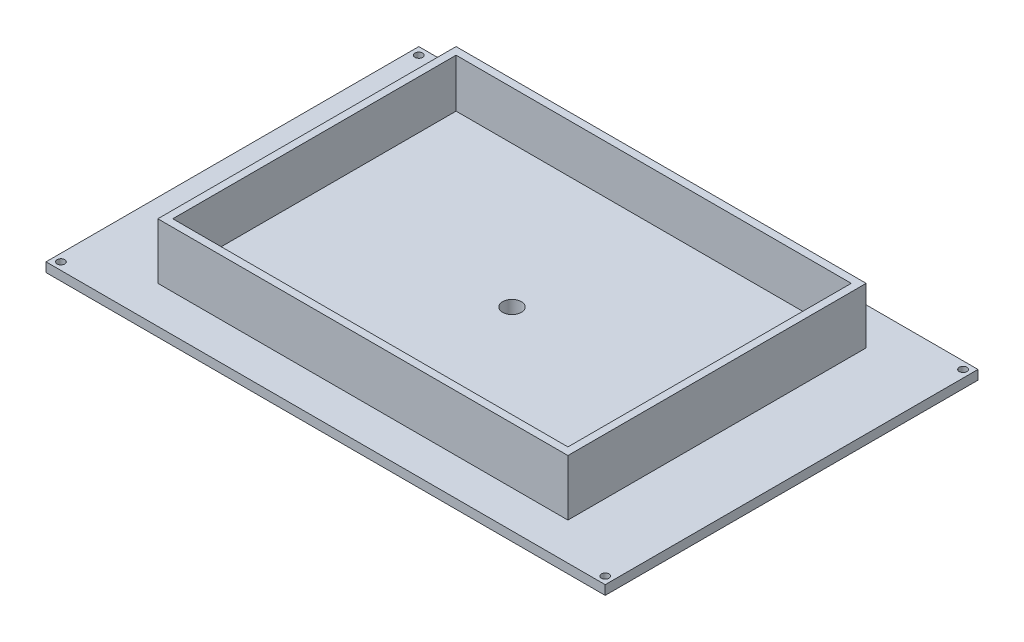
ISO-10303-21;
HEADER;
FILE_DESCRIPTION(('STEP AP214'),'2;1');
FILE_NAME('part.step','',(''),(''),'','','');
FILE_SCHEMA(('AUTOMOTIVE_DESIGN { 1 0 10303 214 1 1 1 1 }'));
ENDSEC;
DATA;
#1=APPLICATION_CONTEXT('core data for automotive mechanical design processes');
#2=APPLICATION_PROTOCOL_DEFINITION('international standard','automotive_design',2000,#1);
#3=PRODUCT_CONTEXT('',#1,'mechanical');
#4=PRODUCT('Part','Part','',(#3));
#5=PRODUCT_RELATED_PRODUCT_CATEGORY('part','',(#4));
#6=PRODUCT_DEFINITION_FORMATION('','',#4);
#7=PRODUCT_DEFINITION_CONTEXT('part definition',#1,'design');
#8=PRODUCT_DEFINITION('design','',#6,#7);
#9=PRODUCT_DEFINITION_SHAPE('','',#8);
#10=(LENGTH_UNIT() NAMED_UNIT(*) SI_UNIT(.MILLI.,.METRE.));
#11=(NAMED_UNIT(*) PLANE_ANGLE_UNIT() SI_UNIT($,.RADIAN.));
#12=(NAMED_UNIT(*) SI_UNIT($,.STERADIAN.) SOLID_ANGLE_UNIT());
#13=UNCERTAINTY_MEASURE_WITH_UNIT(LENGTH_MEASURE(1.E-05),#10,'distance_accuracy_value','');
#14=(GEOMETRIC_REPRESENTATION_CONTEXT(3) GLOBAL_UNCERTAINTY_ASSIGNED_CONTEXT((#13)) GLOBAL_UNIT_ASSIGNED_CONTEXT((#10,
#11,#12)) REPRESENTATION_CONTEXT('',''));
#15=CARTESIAN_POINT('',(0.,0.,0.));
#16=DIRECTION('',(0.,0.,1.));
#17=DIRECTION('',(1.,0.,0.));
#18=AXIS2_PLACEMENT_3D('',#15,#16,#17);
#19=CARTESIAN_POINT('',(110.,30.,-80.));
#20=DIRECTION('',(0.,0.,1.));
#21=DIRECTION('',(1.,0.,0.));
#22=AXIS2_PLACEMENT_3D('',#19,#20,#21);
#23=PLANE('',#22);
#24=DIRECTION('',(-1.,0.,0.));
#25=VECTOR('',#24,1.);
#26=CARTESIAN_POINT('',(110.,0.,-80.));
#27=LINE('',#26,#25);
#28=CARTESIAN_POINT('',(110.,0.,-80.));
#29=VERTEX_POINT('',#28);
#30=CARTESIAN_POINT('',(-110.,0.,-80.));
#31=VERTEX_POINT('',#30);
#32=EDGE_CURVE('E209',#29,#31,#27,.T.);
#33=ORIENTED_EDGE('',*,*,#32,.T.);
#34=DIRECTION('',(0.,-1.,0.));
#35=VECTOR('',#34,1.);
#36=CARTESIAN_POINT('',(-110.,30.,-80.));
#37=LINE('',#36,#35);
#38=CARTESIAN_POINT('',(-110.,30.,-80.));
#39=VERTEX_POINT('',#38);
#40=EDGE_CURVE('E11',#39,#31,#37,.T.);
#41=ORIENTED_EDGE('',*,*,#40,.F.);
#42=DIRECTION('',(-1.,0.,0.));
#43=VECTOR('',#42,1.);
#44=CARTESIAN_POINT('',(110.,30.,-80.));
#45=LINE('',#44,#43);
#46=CARTESIAN_POINT('',(110.,30.,-80.));
#47=VERTEX_POINT('',#46);
#48=EDGE_CURVE('E90',#47,#39,#45,.T.);
#49=ORIENTED_EDGE('',*,*,#48,.F.);
#50=DIRECTION('',(0.,-1.,0.));
#51=VECTOR('',#50,1.);
#52=CARTESIAN_POINT('',(110.,30.,-80.));
#53=LINE('',#52,#51);
#54=EDGE_CURVE('E230',#47,#29,#53,.T.);
#55=ORIENTED_EDGE('',*,*,#54,.T.);
#56=EDGE_LOOP('',(#33,#41,#49,#55));
#57=FACE_BOUND('',#56,.T.);
#58=ADVANCED_FACE('F43',(#57),#23,.F.);
#59=CARTESIAN_POINT('',(-110.,30.,80.));
#60=DIRECTION('',(-1.,0.,0.));
#61=DIRECTION('',(0.,0.,1.));
#62=AXIS2_PLACEMENT_3D('',#59,#60,#61);
#63=PLANE('',#62);
#64=DIRECTION('',(0.,0.,-1.));
#65=VECTOR('',#64,1.);
#66=CARTESIAN_POINT('',(-110.,0.,80.));
#67=LINE('',#66,#65);
#68=CARTESIAN_POINT('',(-110.,0.,80.));
#69=VERTEX_POINT('',#68);
#70=EDGE_CURVE('E233',#69,#31,#67,.T.);
#71=ORIENTED_EDGE('',*,*,#70,.F.);
#72=DIRECTION('',(0.,-1.,0.));
#73=VECTOR('',#72,1.);
#74=CARTESIAN_POINT('',(-110.,30.,80.));
#75=LINE('',#74,#73);
#76=CARTESIAN_POINT('',(-110.,30.,80.));
#77=VERTEX_POINT('',#76);
#78=EDGE_CURVE('E51',#77,#69,#75,.T.);
#79=ORIENTED_EDGE('',*,*,#78,.F.);
#80=DIRECTION('',(0.,0.,-1.));
#81=VECTOR('',#80,1.);
#82=CARTESIAN_POINT('',(-110.,30.,80.));
#83=LINE('',#82,#81);
#84=EDGE_CURVE('E220',#77,#39,#83,.T.);
#85=ORIENTED_EDGE('',*,*,#84,.T.);
#86=ORIENTED_EDGE('',*,*,#40,.T.);
#87=EDGE_LOOP('',(#71,#79,#85,#86));
#88=FACE_BOUND('',#87,.T.);
#89=ADVANCED_FACE('F253',(#88),#63,.T.);
#90=CARTESIAN_POINT('',(110.,30.,80.));
#91=DIRECTION('',(0.,0.,1.));
#92=DIRECTION('',(1.,0.,0.));
#93=AXIS2_PLACEMENT_3D('',#90,#91,#92);
#94=PLANE('',#93);
#95=DIRECTION('',(-1.,0.,0.));
#96=VECTOR('',#95,1.);
#97=CARTESIAN_POINT('',(110.,0.,80.));
#98=LINE('',#97,#96);
#99=CARTESIAN_POINT('',(110.,0.,80.));
#100=VERTEX_POINT('',#99);
#101=EDGE_CURVE('E237',#100,#69,#98,.T.);
#102=ORIENTED_EDGE('',*,*,#101,.F.);
#103=DIRECTION('',(0.,-1.,0.));
#104=VECTOR('',#103,1.);
#105=CARTESIAN_POINT('',(110.,30.,80.));
#106=LINE('',#105,#104);
#107=CARTESIAN_POINT('',(110.,30.,80.));
#108=VERTEX_POINT('',#107);
#109=EDGE_CURVE('E245',#108,#100,#106,.T.);
#110=ORIENTED_EDGE('',*,*,#109,.F.);
#111=DIRECTION('',(-1.,0.,0.));
#112=VECTOR('',#111,1.);
#113=CARTESIAN_POINT('',(110.,30.,80.));
#114=LINE('',#113,#112);
#115=EDGE_CURVE('E224',#108,#77,#114,.T.);
#116=ORIENTED_EDGE('',*,*,#115,.T.);
#117=ORIENTED_EDGE('',*,*,#78,.T.);
#118=EDGE_LOOP('',(#102,#110,#116,#117));
#119=FACE_BOUND('',#118,.T.);
#120=ADVANCED_FACE('F251',(#119),#94,.T.);
#121=CARTESIAN_POINT('',(110.,30.,80.));
#122=DIRECTION('',(-1.,0.,0.));
#123=DIRECTION('',(0.,0.,1.));
#124=AXIS2_PLACEMENT_3D('',#121,#122,#123);
#125=PLANE('',#124);
#126=DIRECTION('',(0.,0.,-1.));
#127=VECTOR('',#126,1.);
#128=CARTESIAN_POINT('',(110.,0.,80.));
#129=LINE('',#128,#127);
#130=EDGE_CURVE('E85',#100,#29,#129,.T.);
#131=ORIENTED_EDGE('',*,*,#130,.T.);
#132=ORIENTED_EDGE('',*,*,#54,.F.);
#133=DIRECTION('',(0.,0.,-1.));
#134=VECTOR('',#133,1.);
#135=CARTESIAN_POINT('',(110.,30.,80.));
#136=LINE('',#135,#134);
#137=EDGE_CURVE('E67',#108,#47,#136,.T.);
#138=ORIENTED_EDGE('',*,*,#137,.F.);
#139=ORIENTED_EDGE('',*,*,#109,.T.);
#140=EDGE_LOOP('',(#131,#132,#138,#139));
#141=FACE_BOUND('',#140,.T.);
#142=ADVANCED_FACE('F258',(#141),#125,.F.);
#143=CARTESIAN_POINT('',(0.,30.,0.));
#144=DIRECTION('',(0.,-1.,0.));
#145=DIRECTION('',(0.,0.,-1.));
#146=AXIS2_PLACEMENT_3D('',#143,#144,#145);
#147=PLANE('',#146);
#148=DIRECTION('',(-1.,0.,0.));
#149=VECTOR('',#148,1.);
#150=CARTESIAN_POINT('',(-106.,30.,-76.));
#151=LINE('',#150,#149);
#152=CARTESIAN_POINT('',(106.,30.,-76.));
#153=VERTEX_POINT('',#152);
#154=CARTESIAN_POINT('',(-106.,30.,-76.));
#155=VERTEX_POINT('',#154);
#156=EDGE_CURVE('E172',#153,#155,#151,.T.);
#157=ORIENTED_EDGE('',*,*,#156,.F.);
#158=DIRECTION('',(0.,0.,-1.));
#159=VECTOR('',#158,1.);
#160=CARTESIAN_POINT('',(106.,30.,76.));
#161=LINE('',#160,#159);
#162=CARTESIAN_POINT('',(106.,30.,76.));
#163=VERTEX_POINT('',#162);
#164=EDGE_CURVE('E58',#163,#153,#161,.T.);
#165=ORIENTED_EDGE('',*,*,#164,.F.);
#166=DIRECTION('',(1.,0.,0.));
#167=VECTOR('',#166,1.);
#168=CARTESIAN_POINT('',(-106.,30.,76.));
#169=LINE('',#168,#167);
#170=CARTESIAN_POINT('',(-106.,30.,76.));
#171=VERTEX_POINT('',#170);
#172=EDGE_CURVE('E183',#171,#163,#169,.T.);
#173=ORIENTED_EDGE('',*,*,#172,.F.);
#174=DIRECTION('',(0.,0.,1.));
#175=VECTOR('',#174,1.);
#176=CARTESIAN_POINT('',(-106.,30.,76.));
#177=LINE('',#176,#175);
#178=EDGE_CURVE('E199',#155,#171,#177,.T.);
#179=ORIENTED_EDGE('',*,*,#178,.F.);
#180=EDGE_LOOP('',(#157,#165,#173,#179));
#181=FACE_BOUND('',#180,.T.);
#182=ORIENTED_EDGE('',*,*,#48,.T.);
#183=ORIENTED_EDGE('',*,*,#84,.F.);
#184=ORIENTED_EDGE('',*,*,#115,.F.);
#185=ORIENTED_EDGE('',*,*,#137,.T.);
#186=EDGE_LOOP('',(#182,#183,#184,#185));
#187=FACE_BOUND('',#186,.T.);
#188=ADVANCED_FACE('F259',(#181,#187),#147,.F.);
#189=CARTESIAN_POINT('',(106.,4.,76.));
#190=DIRECTION('',(1.,0.,0.));
#191=DIRECTION('',(0.,0.,-1.));
#192=AXIS2_PLACEMENT_3D('',#189,#190,#191);
#193=PLANE('',#192);
#194=ORIENTED_EDGE('',*,*,#164,.T.);
#195=DIRECTION('',(0.,1.,0.));
#196=VECTOR('',#195,1.);
#197=CARTESIAN_POINT('',(106.,4.,-76.));
#198=LINE('',#197,#196);
#199=CARTESIAN_POINT('',(106.,4.,-76.));
#200=VERTEX_POINT('',#199);
#201=EDGE_CURVE('E194',#200,#153,#198,.T.);
#202=ORIENTED_EDGE('',*,*,#201,.F.);
#203=DIRECTION('',(0.,0.,-1.));
#204=VECTOR('',#203,1.);
#205=CARTESIAN_POINT('',(106.,4.,76.));
#206=LINE('',#205,#204);
#207=CARTESIAN_POINT('',(106.,4.,76.));
#208=VERTEX_POINT('',#207);
#209=EDGE_CURVE('E178',#208,#200,#206,.T.);
#210=ORIENTED_EDGE('',*,*,#209,.F.);
#211=DIRECTION('',(0.,1.,0.));
#212=VECTOR('',#211,1.);
#213=CARTESIAN_POINT('',(106.,4.,76.));
#214=LINE('',#213,#212);
#215=EDGE_CURVE('E206',#208,#163,#214,.T.);
#216=ORIENTED_EDGE('',*,*,#215,.T.);
#217=EDGE_LOOP('',(#194,#202,#210,#216));
#218=FACE_BOUND('',#217,.T.);
#219=ADVANCED_FACE('F261',(#218),#193,.F.);
#220=CARTESIAN_POINT('',(-106.,4.,76.));
#221=DIRECTION('',(0.,0.,1.));
#222=DIRECTION('',(1.,0.,0.));
#223=AXIS2_PLACEMENT_3D('',#220,#221,#222);
#224=PLANE('',#223);
#225=ORIENTED_EDGE('',*,*,#172,.T.);
#226=ORIENTED_EDGE('',*,*,#215,.F.);
#227=DIRECTION('',(1.,0.,0.));
#228=VECTOR('',#227,1.);
#229=CARTESIAN_POINT('',(-106.,4.,76.));
#230=LINE('',#229,#228);
#231=CARTESIAN_POINT('',(-106.,4.,76.));
#232=VERTEX_POINT('',#231);
#233=EDGE_CURVE('E191',#232,#208,#230,.T.);
#234=ORIENTED_EDGE('',*,*,#233,.F.);
#235=DIRECTION('',(0.,1.,0.));
#236=VECTOR('',#235,1.);
#237=CARTESIAN_POINT('',(-106.,4.,76.));
#238=LINE('',#237,#236);
#239=EDGE_CURVE('E210',#232,#171,#238,.T.);
#240=ORIENTED_EDGE('',*,*,#239,.T.);
#241=EDGE_LOOP('',(#225,#226,#234,#240));
#242=FACE_BOUND('',#241,.T.);
#243=ADVANCED_FACE('F268',(#242),#224,.F.);
#244=CARTESIAN_POINT('',(-106.,4.,76.));
#245=DIRECTION('',(-1.,0.,0.));
#246=DIRECTION('',(0.,0.,1.));
#247=AXIS2_PLACEMENT_3D('',#244,#245,#246);
#248=PLANE('',#247);
#249=ORIENTED_EDGE('',*,*,#178,.T.);
#250=ORIENTED_EDGE('',*,*,#239,.F.);
#251=DIRECTION('',(0.,0.,1.));
#252=VECTOR('',#251,1.);
#253=CARTESIAN_POINT('',(-106.,4.,76.));
#254=LINE('',#253,#252);
#255=CARTESIAN_POINT('',(-106.,4.,-76.));
#256=VERTEX_POINT('',#255);
#257=EDGE_CURVE('E187',#256,#232,#254,.T.);
#258=ORIENTED_EDGE('',*,*,#257,.F.);
#259=DIRECTION('',(0.,1.,0.));
#260=VECTOR('',#259,1.);
#261=CARTESIAN_POINT('',(-106.,4.,-76.));
#262=LINE('',#261,#260);
#263=EDGE_CURVE('E213',#256,#155,#262,.T.);
#264=ORIENTED_EDGE('',*,*,#263,.T.);
#265=EDGE_LOOP('',(#249,#250,#258,#264));
#266=FACE_BOUND('',#265,.T.);
#267=ADVANCED_FACE('F436',(#266),#248,.F.);
#268=CARTESIAN_POINT('',(-106.,4.,-76.));
#269=DIRECTION('',(0.,0.,-1.));
#270=DIRECTION('',(-1.,0.,0.));
#271=AXIS2_PLACEMENT_3D('',#268,#269,#270);
#272=PLANE('',#271);
#273=ORIENTED_EDGE('',*,*,#156,.T.);
#274=ORIENTED_EDGE('',*,*,#263,.F.);
#275=DIRECTION('',(-1.,0.,0.));
#276=VECTOR('',#275,1.);
#277=CARTESIAN_POINT('',(-106.,4.,-76.));
#278=LINE('',#277,#276);
#279=EDGE_CURVE('E182',#200,#256,#278,.T.);
#280=ORIENTED_EDGE('',*,*,#279,.F.);
#281=ORIENTED_EDGE('',*,*,#201,.T.);
#282=EDGE_LOOP('',(#273,#274,#280,#281));
#283=FACE_BOUND('',#282,.T.);
#284=ADVANCED_FACE('F397',(#283),#272,.F.);
#285=CARTESIAN_POINT('',(0.,4.,0.));
#286=DIRECTION('',(0.,-1.,0.));
#287=DIRECTION('',(0.,0.,-1.));
#288=AXIS2_PLACEMENT_3D('',#285,#286,#287);
#289=PLANE('',#288);
#290=CARTESIAN_POINT('',(0.,4.,0.));
#291=DIRECTION('',(0.,1.,0.));
#292=DIRECTION('',(0.,0.,1.));
#293=AXIS2_PLACEMENT_3D('',#290,#291,#292);
#294=CIRCLE('',#293,5.);
#295=CARTESIAN_POINT('',(0.,4.,5.));
#296=VERTEX_POINT('',#295);
#297=EDGE_CURVE('E508',#296,#296,#294,.T.);
#298=ORIENTED_EDGE('',*,*,#297,.F.);
#299=EDGE_LOOP('',(#298));
#300=FACE_BOUND('',#299,.T.);
#301=ORIENTED_EDGE('',*,*,#209,.T.);
#302=ORIENTED_EDGE('',*,*,#279,.T.);
#303=ORIENTED_EDGE('',*,*,#257,.T.);
#304=ORIENTED_EDGE('',*,*,#233,.T.);
#305=EDGE_LOOP('',(#301,#302,#303,#304));
#306=FACE_BOUND('',#305,.T.);
#307=ADVANCED_FACE('F339',(#300,#306),#289,.F.);
#308=CARTESIAN_POINT('',(0.,0.,0.));
#309=DIRECTION('',(0.,1.,0.));
#310=DIRECTION('',(0.,0.,1.));
#311=AXIS2_PLACEMENT_3D('',#308,#309,#310);
#312=PLANE('',#311);
#313=CARTESIAN_POINT('',(-146.,0.,-96.));
#314=DIRECTION('',(0.,1.,0.));
#315=DIRECTION('',(0.,0.,1.));
#316=AXIS2_PLACEMENT_3D('',#313,#314,#315);
#317=CIRCLE('',#316,2.04999999999999);
#318=CARTESIAN_POINT('',(-146.,0.,-93.95));
#319=VERTEX_POINT('',#318);
#320=EDGE_CURVE('E532',#319,#319,#317,.F.);
#321=ORIENTED_EDGE('',*,*,#320,.T.);
#322=EDGE_LOOP('',(#321));
#323=FACE_BOUND('',#322,.T.);
#324=CARTESIAN_POINT('',(146.,0.,-96.));
#325=DIRECTION('',(0.,1.,0.));
#326=DIRECTION('',(0.,0.,1.));
#327=AXIS2_PLACEMENT_3D('',#324,#325,#326);
#328=CIRCLE('',#327,2.04999999999999);
#329=CARTESIAN_POINT('',(146.,0.,-93.95));
#330=VERTEX_POINT('',#329);
#331=EDGE_CURVE('E524',#330,#330,#328,.F.);
#332=ORIENTED_EDGE('',*,*,#331,.T.);
#333=EDGE_LOOP('',(#332));
#334=FACE_BOUND('',#333,.T.);
#335=CARTESIAN_POINT('',(146.,0.,96.));
#336=DIRECTION('',(0.,1.,0.));
#337=DIRECTION('',(0.,0.,1.));
#338=AXIS2_PLACEMENT_3D('',#335,#336,#337);
#339=CIRCLE('',#338,2.04999999999999);
#340=CARTESIAN_POINT('',(146.,0.,98.05));
#341=VERTEX_POINT('',#340);
#342=EDGE_CURVE('E515',#341,#341,#339,.F.);
#343=ORIENTED_EDGE('',*,*,#342,.T.);
#344=EDGE_LOOP('',(#343));
#345=FACE_BOUND('',#344,.T.);
#346=CARTESIAN_POINT('',(-146.,0.,96.));
#347=DIRECTION('',(0.,1.,0.));
#348=DIRECTION('',(0.,0.,1.));
#349=AXIS2_PLACEMENT_3D('',#346,#347,#348);
#350=CIRCLE('',#349,2.04999999999999);
#351=CARTESIAN_POINT('',(-146.,0.,98.05));
#352=VERTEX_POINT('',#351);
#353=EDGE_CURVE('E519',#352,#352,#350,.F.);
#354=ORIENTED_EDGE('',*,*,#353,.T.);
#355=EDGE_LOOP('',(#354));
#356=FACE_BOUND('',#355,.T.);
#357=DIRECTION('',(0.,0.,1.));
#358=VECTOR('',#357,1.);
#359=CARTESIAN_POINT('',(150.,0.,-100.));
#360=LINE('',#359,#358);
#361=CARTESIAN_POINT('',(150.,0.,-100.));
#362=VERTEX_POINT('',#361);
#363=CARTESIAN_POINT('',(150.,0.,100.));
#364=VERTEX_POINT('',#363);
#365=EDGE_CURVE('E167',#362,#364,#360,.T.);
#366=ORIENTED_EDGE('',*,*,#365,.F.);
#367=DIRECTION('',(1.,0.,0.));
#368=VECTOR('',#367,1.);
#369=CARTESIAN_POINT('',(-150.,0.,-100.));
#370=LINE('',#369,#368);
#371=CARTESIAN_POINT('',(-150.,0.,-100.));
#372=VERTEX_POINT('',#371);
#373=EDGE_CURVE('E163',#372,#362,#370,.T.);
#374=ORIENTED_EDGE('',*,*,#373,.F.);
#375=DIRECTION('',(0.,0.,-1.));
#376=VECTOR('',#375,1.);
#377=CARTESIAN_POINT('',(-150.,0.,-100.));
#378=LINE('',#377,#376);
#379=CARTESIAN_POINT('',(-150.,0.,100.));
#380=VERTEX_POINT('',#379);
#381=EDGE_CURVE('E556',#380,#372,#378,.T.);
#382=ORIENTED_EDGE('',*,*,#381,.F.);
#383=DIRECTION('',(-1.,0.,0.));
#384=VECTOR('',#383,1.);
#385=CARTESIAN_POINT('',(-150.,0.,100.));
#386=LINE('',#385,#384);
#387=EDGE_CURVE('E553',#364,#380,#386,.T.);
#388=ORIENTED_EDGE('',*,*,#387,.F.);
#389=EDGE_LOOP('',(#366,#374,#382,#388));
#390=FACE_BOUND('',#389,.T.);
#391=ORIENTED_EDGE('',*,*,#32,.F.);
#392=ORIENTED_EDGE('',*,*,#130,.F.);
#393=ORIENTED_EDGE('',*,*,#101,.T.);
#394=ORIENTED_EDGE('',*,*,#70,.T.);
#395=EDGE_LOOP('',(#391,#392,#393,#394));
#396=FACE_BOUND('',#395,.T.);
#397=ADVANCED_FACE('F256',(#323,#334,#345,#356,#390,#396),#312,.T.);
#398=CARTESIAN_POINT('',(150.,-5.,-100.));
#399=DIRECTION('',(-1.,0.,0.));
#400=DIRECTION('',(0.,0.,1.));
#401=AXIS2_PLACEMENT_3D('',#398,#399,#400);
#402=PLANE('',#401);
#403=ORIENTED_EDGE('',*,*,#365,.T.);
#404=DIRECTION('',(0.,1.,0.));
#405=VECTOR('',#404,1.);
#406=CARTESIAN_POINT('',(150.,-5.,100.));
#407=LINE('',#406,#405);
#408=CARTESIAN_POINT('',(150.,-5.,100.));
#409=VERTEX_POINT('',#408);
#410=EDGE_CURVE('E145',#409,#364,#407,.T.);
#411=ORIENTED_EDGE('',*,*,#410,.F.);
#412=DIRECTION('',(0.,0.,1.));
#413=VECTOR('',#412,1.);
#414=CARTESIAN_POINT('',(150.,-5.,-100.));
#415=LINE('',#414,#413);
#416=CARTESIAN_POINT('',(150.,-5.,-100.));
#417=VERTEX_POINT('',#416);
#418=EDGE_CURVE('E153',#417,#409,#415,.T.);
#419=ORIENTED_EDGE('',*,*,#418,.F.);
#420=DIRECTION('',(0.,1.,0.));
#421=VECTOR('',#420,1.);
#422=CARTESIAN_POINT('',(150.,-5.,-100.));
#423=LINE('',#422,#421);
#424=EDGE_CURVE('E550',#417,#362,#423,.T.);
#425=ORIENTED_EDGE('',*,*,#424,.T.);
#426=EDGE_LOOP('',(#403,#411,#419,#425));
#427=FACE_BOUND('',#426,.T.);
#428=ADVANCED_FACE('F165',(#427),#402,.F.);
#429=CARTESIAN_POINT('',(-150.,-5.,100.));
#430=DIRECTION('',(0.,0.,-1.));
#431=DIRECTION('',(-1.,0.,0.));
#432=AXIS2_PLACEMENT_3D('',#429,#430,#431);
#433=PLANE('',#432);
#434=ORIENTED_EDGE('',*,*,#387,.T.);
#435=DIRECTION('',(0.,1.,0.));
#436=VECTOR('',#435,1.);
#437=CARTESIAN_POINT('',(-150.,-5.,100.));
#438=LINE('',#437,#436);
#439=CARTESIAN_POINT('',(-150.,-5.,100.));
#440=VERTEX_POINT('',#439);
#441=EDGE_CURVE('E148',#440,#380,#438,.T.);
#442=ORIENTED_EDGE('',*,*,#441,.F.);
#443=DIRECTION('',(-1.,0.,0.));
#444=VECTOR('',#443,1.);
#445=CARTESIAN_POINT('',(-150.,-5.,100.));
#446=LINE('',#445,#444);
#447=EDGE_CURVE('E141',#409,#440,#446,.T.);
#448=ORIENTED_EDGE('',*,*,#447,.F.);
#449=ORIENTED_EDGE('',*,*,#410,.T.);
#450=EDGE_LOOP('',(#434,#442,#448,#449));
#451=FACE_BOUND('',#450,.T.);
#452=ADVANCED_FACE('F143',(#451),#433,.F.);
#453=CARTESIAN_POINT('',(-150.,-5.,-100.));
#454=DIRECTION('',(1.,0.,0.));
#455=DIRECTION('',(0.,0.,-1.));
#456=AXIS2_PLACEMENT_3D('',#453,#454,#455);
#457=PLANE('',#456);
#458=ORIENTED_EDGE('',*,*,#381,.T.);
#459=DIRECTION('',(0.,1.,0.));
#460=VECTOR('',#459,1.);
#461=CARTESIAN_POINT('',(-150.,-5.,-100.));
#462=LINE('',#461,#460);
#463=CARTESIAN_POINT('',(-150.,-5.,-100.));
#464=VERTEX_POINT('',#463);
#465=EDGE_CURVE('E174',#464,#372,#462,.T.);
#466=ORIENTED_EDGE('',*,*,#465,.F.);
#467=DIRECTION('',(0.,0.,-1.));
#468=VECTOR('',#467,1.);
#469=CARTESIAN_POINT('',(-150.,-5.,-100.));
#470=LINE('',#469,#468);
#471=EDGE_CURVE('E152',#440,#464,#470,.T.);
#472=ORIENTED_EDGE('',*,*,#471,.F.);
#473=ORIENTED_EDGE('',*,*,#441,.T.);
#474=EDGE_LOOP('',(#458,#466,#472,#473));
#475=FACE_BOUND('',#474,.T.);
#476=ADVANCED_FACE('F308',(#475),#457,.F.);
#477=CARTESIAN_POINT('',(-150.,-5.,-100.));
#478=DIRECTION('',(0.,0.,1.));
#479=DIRECTION('',(1.,0.,0.));
#480=AXIS2_PLACEMENT_3D('',#477,#478,#479);
#481=PLANE('',#480);
#482=ORIENTED_EDGE('',*,*,#373,.T.);
#483=ORIENTED_EDGE('',*,*,#424,.F.);
#484=DIRECTION('',(1.,0.,0.));
#485=VECTOR('',#484,1.);
#486=CARTESIAN_POINT('',(-150.,-5.,-100.));
#487=LINE('',#486,#485);
#488=EDGE_CURVE('E158',#464,#417,#487,.T.);
#489=ORIENTED_EDGE('',*,*,#488,.F.);
#490=ORIENTED_EDGE('',*,*,#465,.T.);
#491=EDGE_LOOP('',(#482,#483,#489,#490));
#492=FACE_BOUND('',#491,.T.);
#493=ADVANCED_FACE('F318',(#492),#481,.F.);
#494=CARTESIAN_POINT('',(0.,-5.,0.));
#495=DIRECTION('',(0.,1.,0.));
#496=DIRECTION('',(0.,0.,1.));
#497=AXIS2_PLACEMENT_3D('',#494,#495,#496);
#498=PLANE('',#497);
#499=CARTESIAN_POINT('',(0.,-5.,0.));
#500=DIRECTION('',(0.,1.,0.));
#501=DIRECTION('',(0.,0.,1.));
#502=AXIS2_PLACEMENT_3D('',#499,#500,#501);
#503=CIRCLE('',#502,5.);
#504=CARTESIAN_POINT('',(0.,-5.,5.));
#505=VERTEX_POINT('',#504);
#506=EDGE_CURVE('E505',#505,#505,#503,.T.);
#507=ORIENTED_EDGE('',*,*,#506,.T.);
#508=EDGE_LOOP('',(#507));
#509=FACE_BOUND('',#508,.T.);
#510=CARTESIAN_POINT('',(-146.,-5.,-96.));
#511=DIRECTION('',(0.,-1.,0.));
#512=DIRECTION('',(0.,0.,1.));
#513=AXIS2_PLACEMENT_3D('',#510,#511,#512);
#514=CIRCLE('',#513,2.04999999999999);
#515=CARTESIAN_POINT('',(-146.,-5.,-93.95));
#516=VERTEX_POINT('',#515);
#517=EDGE_CURVE('E512',#516,#516,#514,.T.);
#518=ORIENTED_EDGE('',*,*,#517,.F.);
#519=EDGE_LOOP('',(#518));
#520=FACE_BOUND('',#519,.T.);
#521=CARTESIAN_POINT('',(146.,-5.,-96.));
#522=DIRECTION('',(0.,-1.,0.));
#523=DIRECTION('',(0.,0.,-1.));
#524=AXIS2_PLACEMENT_3D('',#521,#522,#523);
#525=CIRCLE('',#524,2.04999999999999);
#526=CARTESIAN_POINT('',(146.,-5.,-98.05));
#527=VERTEX_POINT('',#526);
#528=EDGE_CURVE('E528',#527,#527,#525,.T.);
#529=ORIENTED_EDGE('',*,*,#528,.F.);
#530=EDGE_LOOP('',(#529));
#531=FACE_BOUND('',#530,.T.);
#532=CARTESIAN_POINT('',(146.,-5.,96.));
#533=DIRECTION('',(0.,-1.,0.));
#534=DIRECTION('',(0.,0.,1.));
#535=AXIS2_PLACEMENT_3D('',#532,#533,#534);
#536=CIRCLE('',#535,2.04999999999999);
#537=CARTESIAN_POINT('',(146.,-5.,98.05));
#538=VERTEX_POINT('',#537);
#539=EDGE_CURVE('E520',#538,#538,#536,.T.);
#540=ORIENTED_EDGE('',*,*,#539,.F.);
#541=EDGE_LOOP('',(#540));
#542=FACE_BOUND('',#541,.T.);
#543=CARTESIAN_POINT('',(-146.,-5.,96.));
#544=DIRECTION('',(0.,-1.,0.));
#545=DIRECTION('',(0.,0.,-1.));
#546=AXIS2_PLACEMENT_3D('',#543,#544,#545);
#547=CIRCLE('',#546,2.04999999999999);
#548=CARTESIAN_POINT('',(-146.,-5.,93.95));
#549=VERTEX_POINT('',#548);
#550=EDGE_CURVE('E539',#549,#549,#547,.T.);
#551=ORIENTED_EDGE('',*,*,#550,.F.);
#552=EDGE_LOOP('',(#551));
#553=FACE_BOUND('',#552,.T.);
#554=ORIENTED_EDGE('',*,*,#418,.T.);
#555=ORIENTED_EDGE('',*,*,#447,.T.);
#556=ORIENTED_EDGE('',*,*,#471,.T.);
#557=ORIENTED_EDGE('',*,*,#488,.T.);
#558=EDGE_LOOP('',(#554,#555,#556,#557));
#559=FACE_BOUND('',#558,.T.);
#560=ADVANCED_FACE('F156',(#509,#520,#531,#542,#553,#559),#498,.F.);
#561=CARTESIAN_POINT('',(-146.,30.001,96.));
#562=DIRECTION('',(0.,-1.,0.));
#563=DIRECTION('',(0.,0.,-1.));
#564=AXIS2_PLACEMENT_3D('',#561,#562,#563);
#565=CYLINDRICAL_SURFACE('',#564,2.04999999999999);
#566=ORIENTED_EDGE('',*,*,#353,.F.);
#567=EDGE_LOOP('',(#566));
#568=FACE_BOUND('',#567,.T.);
#569=ORIENTED_EDGE('',*,*,#550,.T.);
#570=EDGE_LOOP('',(#569));
#571=FACE_BOUND('',#570,.T.);
#572=ADVANCED_FACE('F348',(#568,#571),#565,.F.);
#573=CARTESIAN_POINT('',(146.,30.001,96.));
#574=DIRECTION('',(0.,-1.,0.));
#575=DIRECTION('',(0.,0.,-1.));
#576=AXIS2_PLACEMENT_3D('',#573,#574,#575);
#577=CYLINDRICAL_SURFACE('',#576,2.04999999999999);
#578=ORIENTED_EDGE('',*,*,#342,.F.);
#579=EDGE_LOOP('',(#578));
#580=FACE_BOUND('',#579,.T.);
#581=ORIENTED_EDGE('',*,*,#539,.T.);
#582=EDGE_LOOP('',(#581));
#583=FACE_BOUND('',#582,.T.);
#584=ADVANCED_FACE('F353',(#580,#583),#577,.F.);
#585=CARTESIAN_POINT('',(146.,30.001,-96.));
#586=DIRECTION('',(0.,-1.,0.));
#587=DIRECTION('',(0.,0.,-1.));
#588=AXIS2_PLACEMENT_3D('',#585,#586,#587);
#589=CYLINDRICAL_SURFACE('',#588,2.04999999999999);
#590=ORIENTED_EDGE('',*,*,#331,.F.);
#591=EDGE_LOOP('',(#590));
#592=FACE_BOUND('',#591,.T.);
#593=ORIENTED_EDGE('',*,*,#528,.T.);
#594=EDGE_LOOP('',(#593));
#595=FACE_BOUND('',#594,.T.);
#596=ADVANCED_FACE('F364',(#592,#595),#589,.F.);
#597=CARTESIAN_POINT('',(-146.,30.001,-96.));
#598=DIRECTION('',(0.,-1.,0.));
#599=DIRECTION('',(0.,0.,-1.));
#600=AXIS2_PLACEMENT_3D('',#597,#598,#599);
#601=CYLINDRICAL_SURFACE('',#600,2.04999999999999);
#602=ORIENTED_EDGE('',*,*,#320,.F.);
#603=EDGE_LOOP('',(#602));
#604=FACE_BOUND('',#603,.T.);
#605=ORIENTED_EDGE('',*,*,#517,.T.);
#606=EDGE_LOOP('',(#605));
#607=FACE_BOUND('',#606,.T.);
#608=ADVANCED_FACE('F375',(#604,#607),#601,.F.);
#609=CARTESIAN_POINT('',(0.,-5.,0.));
#610=DIRECTION('',(0.,1.,0.));
#611=DIRECTION('',(0.,0.,1.));
#612=AXIS2_PLACEMENT_3D('',#609,#610,#611);
#613=CYLINDRICAL_SURFACE('',#612,5.);
#614=ORIENTED_EDGE('',*,*,#506,.F.);
#615=EDGE_LOOP('',(#614));
#616=FACE_BOUND('',#615,.T.);
#617=ORIENTED_EDGE('',*,*,#297,.T.);
#618=EDGE_LOOP('',(#617));
#619=FACE_BOUND('',#618,.T.);
#620=ADVANCED_FACE('F386',(#616,#619),#613,.F.);
#621=CLOSED_SHELL('',(#58,#89,#120,#142,#188,#219,#243,#267,#284,#307,#397,#428,#452,#476,#493,
#560,#572,#584,#596,#608,#620));
#622=MANIFOLD_SOLID_BREP('B2',#621);
#623=ADVANCED_BREP_SHAPE_REPRESENTATION('',(#18,#622),#14);
#624=SHAPE_DEFINITION_REPRESENTATION(#9,#623);
ENDSEC;
END-ISO-10303-21;
